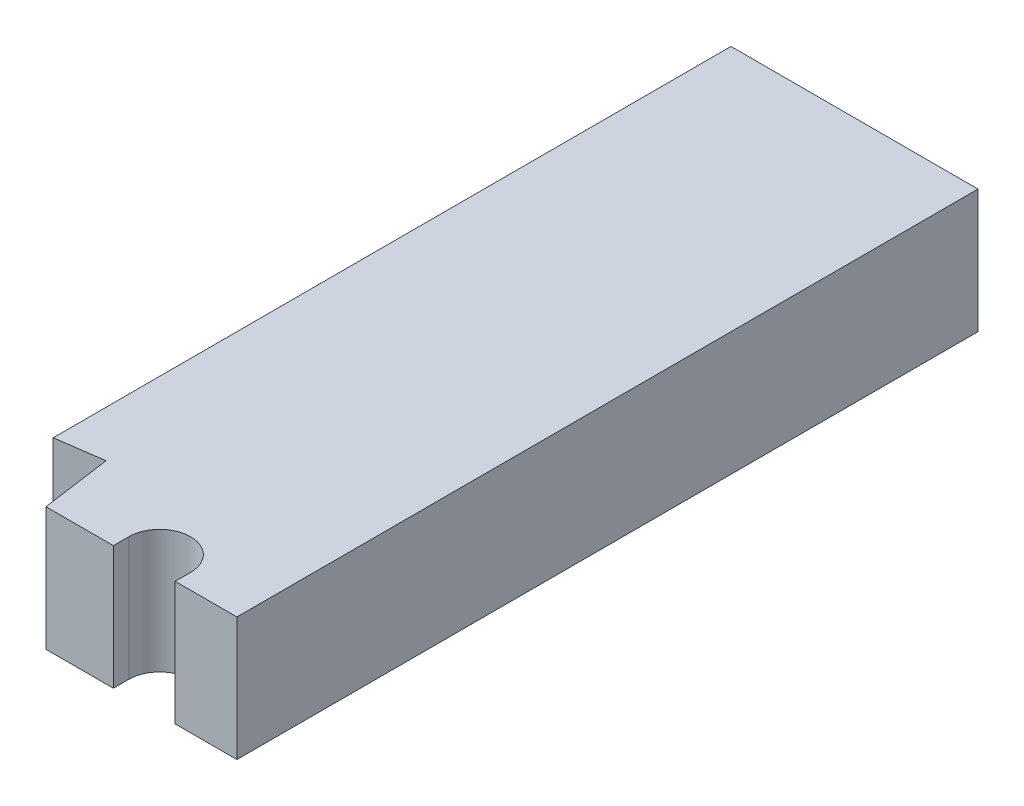
ISO-10303-21;
HEADER;
FILE_DESCRIPTION(('STEP AP214'),'2;1');
FILE_NAME('part.step','',(''),(''),'','','');
FILE_SCHEMA(('AUTOMOTIVE_DESIGN { 1 0 10303 214 1 1 1 1 }'));
ENDSEC;
DATA;
#1=APPLICATION_CONTEXT('core data for automotive mechanical design processes');
#2=APPLICATION_PROTOCOL_DEFINITION('international standard','automotive_design',2000,#1);
#3=PRODUCT_CONTEXT('',#1,'mechanical');
#4=PRODUCT('Part','Part','',(#3));
#5=PRODUCT_RELATED_PRODUCT_CATEGORY('part','',(#4));
#6=PRODUCT_DEFINITION_FORMATION('','',#4);
#7=PRODUCT_DEFINITION_CONTEXT('part definition',#1,'design');
#8=PRODUCT_DEFINITION('design','',#6,#7);
#9=PRODUCT_DEFINITION_SHAPE('','',#8);
#10=(LENGTH_UNIT() NAMED_UNIT(*) SI_UNIT(.MILLI.,.METRE.));
#11=(NAMED_UNIT(*) PLANE_ANGLE_UNIT() SI_UNIT($,.RADIAN.));
#12=(NAMED_UNIT(*) SI_UNIT($,.STERADIAN.) SOLID_ANGLE_UNIT());
#13=UNCERTAINTY_MEASURE_WITH_UNIT(LENGTH_MEASURE(1.E-05),#10,'distance_accuracy_value','');
#14=(GEOMETRIC_REPRESENTATION_CONTEXT(3) GLOBAL_UNCERTAINTY_ASSIGNED_CONTEXT((#13)) GLOBAL_UNIT_ASSIGNED_CONTEXT((#10,
#11,#12)) REPRESENTATION_CONTEXT('',''));
#15=CARTESIAN_POINT('',(0.,0.,0.));
#16=DIRECTION('',(0.,0.,1.));
#17=DIRECTION('',(1.,0.,0.));
#18=AXIS2_PLACEMENT_3D('',#15,#16,#17);
#19=CARTESIAN_POINT('',(-50.8,25.4,304.8));
#20=DIRECTION('',(0.,-1.,0.));
#21=DIRECTION('',(0.,0.,-1.));
#22=AXIS2_PLACEMENT_3D('',#19,#20,#21);
#23=PLANE('',#22);
#24=DIRECTION('',(-1.,0.,0.));
#25=VECTOR('',#24,1.);
#26=CARTESIAN_POINT('',(-50.8,25.4,304.8));
#27=LINE('',#26,#25);
#28=CARTESIAN_POINT('',(0.,25.4,304.8));
#29=VERTEX_POINT('',#28);
#30=CARTESIAN_POINT('',(-27.7126272251705,25.4,304.8));
#31=VERTEX_POINT('',#30);
#32=EDGE_CURVE('E162',#29,#31,#27,.T.);
#33=ORIENTED_EDGE('',*,*,#32,.F.);
#34=DIRECTION('',(0.,0.,-1.));
#35=VECTOR('',#34,1.);
#36=CARTESIAN_POINT('',(0.,25.4,304.8));
#37=LINE('',#36,#35);
#38=CARTESIAN_POINT('',(0.,25.4,298.45));
#39=VERTEX_POINT('',#38);
#40=EDGE_CURVE('E168',#29,#39,#37,.T.);
#41=ORIENTED_EDGE('',*,*,#40,.T.);
#42=CARTESIAN_POINT('',(12.7,25.4,298.45));
#43=DIRECTION('',(0.,1.,0.));
#44=DIRECTION('',(0.,0.,1.));
#45=AXIS2_PLACEMENT_3D('',#42,#43,#44);
#46=CIRCLE('',#45,12.7);
#47=CARTESIAN_POINT('',(25.4,25.4,298.45));
#48=VERTEX_POINT('',#47);
#49=EDGE_CURVE('E44',#48,#39,#46,.T.);
#50=ORIENTED_EDGE('',*,*,#49,.F.);
#51=DIRECTION('',(0.,0.,-1.));
#52=VECTOR('',#51,1.);
#53=CARTESIAN_POINT('',(25.4,25.4,304.8));
#54=LINE('',#53,#52);
#55=CARTESIAN_POINT('',(25.4,25.4,304.8));
#56=VERTEX_POINT('',#55);
#57=EDGE_CURVE('E68',#56,#48,#54,.T.);
#58=ORIENTED_EDGE('',*,*,#57,.F.);
#59=CARTESIAN_POINT('',(50.8,25.4,304.8));
#60=VERTEX_POINT('',#59);
#61=EDGE_CURVE('E159',#60,#56,#27,.T.);
#62=ORIENTED_EDGE('',*,*,#61,.F.);
#63=DIRECTION('',(0.,0.,-1.));
#64=VECTOR('',#63,1.);
#65=CARTESIAN_POINT('',(50.8,25.4,304.8));
#66=LINE('',#65,#64);
#67=CARTESIAN_POINT('',(50.8,25.4,0.));
#68=VERTEX_POINT('',#67);
#69=EDGE_CURVE('E11',#60,#68,#66,.T.);
#70=ORIENTED_EDGE('',*,*,#69,.T.);
#71=DIRECTION('',(-1.,0.,0.));
#72=VECTOR('',#71,1.);
#73=CARTESIAN_POINT('',(-50.8,25.4,0.));
#74=LINE('',#73,#72);
#75=CARTESIAN_POINT('',(-50.8,25.4,0.));
#76=VERTEX_POINT('',#75);
#77=EDGE_CURVE('E141',#68,#76,#74,.T.);
#78=ORIENTED_EDGE('',*,*,#77,.T.);
#79=DIRECTION('',(0.,0.,-1.));
#80=VECTOR('',#79,1.);
#81=CARTESIAN_POINT('',(-50.8,25.4,304.8));
#82=LINE('',#81,#80);
#83=CARTESIAN_POINT('',(-50.8,25.4,278.749902901081));
#84=VERTEX_POINT('',#83);
#85=EDGE_CURVE('E50',#84,#76,#82,.T.);
#86=ORIENTED_EDGE('',*,*,#85,.F.);
#87=DIRECTION('',(-0.99026806874157,0.,0.139173100960067));
#88=VECTOR('',#87,1.);
#89=CARTESIAN_POINT('',(-54.3901899415612,25.4,279.254471192208));
#90=LINE('',#89,#88);
#91=CARTESIAN_POINT('',(-31.75,25.4,276.0726));
#92=VERTEX_POINT('',#91);
#93=EDGE_CURVE('E145',#92,#84,#90,.T.);
#94=ORIENTED_EDGE('',*,*,#93,.F.);
#95=DIRECTION('',(-0.139173100960066,0.,-0.99026806874157));
#96=VECTOR('',#95,1.);
#97=CARTESIAN_POINT('',(-28.1598100584389,25.4,301.618128807792));
#98=LINE('',#97,#96);
#99=EDGE_CURVE('E172',#31,#92,#98,.T.);
#100=ORIENTED_EDGE('',*,*,#99,.F.);
#101=EDGE_LOOP('',(#33,#41,#50,#58,#62,#70,#78,#86,#94,#100));
#102=FACE_BOUND('',#101,.T.);
#103=ADVANCED_FACE('F40',(#102),#23,.F.);
#104=CARTESIAN_POINT('',(-50.8,25.4,304.8));
#105=DIRECTION('',(1.,0.,0.));
#106=DIRECTION('',(0.,1.,0.));
#107=AXIS2_PLACEMENT_3D('',#104,#105,#106);
#108=PLANE('',#107);
#109=DIRECTION('',(0.,1.,0.));
#110=VECTOR('',#109,1.);
#111=CARTESIAN_POINT('',(-50.8,-25.4,278.749902901081));
#112=LINE('',#111,#110);
#113=CARTESIAN_POINT('',(-50.8,-25.4,278.749902901081));
#114=VERTEX_POINT('',#113);
#115=EDGE_CURVE('E79',#114,#84,#112,.T.);
#116=ORIENTED_EDGE('',*,*,#115,.T.);
#117=ORIENTED_EDGE('',*,*,#85,.T.);
#118=DIRECTION('',(0.,-1.,0.));
#119=VECTOR('',#118,1.);
#120=CARTESIAN_POINT('',(-50.8,25.4,0.));
#121=LINE('',#120,#119);
#122=CARTESIAN_POINT('',(-50.8,-25.4,0.));
#123=VERTEX_POINT('',#122);
#124=EDGE_CURVE('E130',#76,#123,#121,.T.);
#125=ORIENTED_EDGE('',*,*,#124,.T.);
#126=DIRECTION('',(0.,0.,-1.));
#127=VECTOR('',#126,1.);
#128=CARTESIAN_POINT('',(-50.8,-25.4,304.8));
#129=LINE('',#128,#127);
#130=EDGE_CURVE('E124',#114,#123,#129,.T.);
#131=ORIENTED_EDGE('',*,*,#130,.F.);
#132=EDGE_LOOP('',(#116,#117,#125,#131));
#133=FACE_BOUND('',#132,.T.);
#134=ADVANCED_FACE('F154',(#133),#108,.F.);
#135=CARTESIAN_POINT('',(-50.8,-25.4,304.8));
#136=DIRECTION('',(0.,1.,0.));
#137=DIRECTION('',(0.,0.,1.));
#138=AXIS2_PLACEMENT_3D('',#135,#136,#137);
#139=PLANE('',#138);
#140=CARTESIAN_POINT('',(12.7,-25.4,298.45));
#141=DIRECTION('',(0.,1.,0.));
#142=DIRECTION('',(0.,0.,1.));
#143=AXIS2_PLACEMENT_3D('',#140,#141,#142);
#144=CIRCLE('',#143,12.7);
#145=CARTESIAN_POINT('',(25.4,-25.4,298.45));
#146=VERTEX_POINT('',#145);
#147=CARTESIAN_POINT('',(0.,-25.4,298.45));
#148=VERTEX_POINT('',#147);
#149=EDGE_CURVE('E196',#146,#148,#144,.T.);
#150=ORIENTED_EDGE('',*,*,#149,.T.);
#151=DIRECTION('',(0.,0.,1.));
#152=VECTOR('',#151,1.);
#153=CARTESIAN_POINT('',(0.,-25.4,0.));
#154=LINE('',#153,#152);
#155=CARTESIAN_POINT('',(0.,-25.4,304.8));
#156=VERTEX_POINT('',#155);
#157=EDGE_CURVE('E191',#148,#156,#154,.T.);
#158=ORIENTED_EDGE('',*,*,#157,.T.);
#159=DIRECTION('',(1.,0.,0.));
#160=VECTOR('',#159,1.);
#161=CARTESIAN_POINT('',(-50.8,-25.4,304.8));
#162=LINE('',#161,#160);
#163=CARTESIAN_POINT('',(-27.7126272251705,-25.4,304.8));
#164=VERTEX_POINT('',#163);
#165=EDGE_CURVE('E137',#164,#156,#162,.T.);
#166=ORIENTED_EDGE('',*,*,#165,.F.);
#167=DIRECTION('',(0.139173100960066,0.,0.99026806874157));
#168=VECTOR('',#167,1.);
#169=CARTESIAN_POINT('',(-69.182990161783,-25.4,9.72303518454435));
#170=LINE('',#169,#168);
#171=CARTESIAN_POINT('',(-31.75,-25.4,276.0726));
#172=VERTEX_POINT('',#171);
#173=EDGE_CURVE('E183',#172,#164,#170,.T.);
#174=ORIENTED_EDGE('',*,*,#173,.F.);
#175=DIRECTION('',(0.99026806874157,0.,-0.139173100960067));
#176=VECTOR('',#175,1.);
#177=CARTESIAN_POINT('',(37.4329901617833,-25.4,266.349564815455));
#178=LINE('',#177,#176);
#179=EDGE_CURVE('E178',#114,#172,#178,.T.);
#180=ORIENTED_EDGE('',*,*,#179,.F.);
#181=ORIENTED_EDGE('',*,*,#130,.T.);
#182=DIRECTION('',(1.,0.,0.));
#183=VECTOR('',#182,1.);
#184=CARTESIAN_POINT('',(-50.8,-25.4,0.));
#185=LINE('',#184,#183);
#186=CARTESIAN_POINT('',(50.8,-25.4,0.));
#187=VERTEX_POINT('',#186);
#188=EDGE_CURVE('E116',#123,#187,#185,.T.);
#189=ORIENTED_EDGE('',*,*,#188,.T.);
#190=DIRECTION('',(0.,0.,-1.));
#191=VECTOR('',#190,1.);
#192=CARTESIAN_POINT('',(50.8,-25.4,304.8));
#193=LINE('',#192,#191);
#194=CARTESIAN_POINT('',(50.8,-25.4,304.8));
#195=VERTEX_POINT('',#194);
#196=EDGE_CURVE('E121',#195,#187,#193,.T.);
#197=ORIENTED_EDGE('',*,*,#196,.F.);
#198=CARTESIAN_POINT('',(25.4,-25.4,304.8));
#199=VERTEX_POINT('',#198);
#200=EDGE_CURVE('E147',#199,#195,#162,.T.);
#201=ORIENTED_EDGE('',*,*,#200,.F.);
#202=DIRECTION('',(0.,0.,1.));
#203=VECTOR('',#202,1.);
#204=CARTESIAN_POINT('',(25.4,-25.4,0.));
#205=LINE('',#204,#203);
#206=EDGE_CURVE('E58',#146,#199,#205,.T.);
#207=ORIENTED_EDGE('',*,*,#206,.F.);
#208=EDGE_LOOP('',(#150,#158,#166,#174,#180,#181,#189,#197,#201,#207));
#209=FACE_BOUND('',#208,.T.);
#210=ADVANCED_FACE('F119',(#209),#139,.F.);
#211=CARTESIAN_POINT('',(0.,0.,304.8));
#212=DIRECTION('',(0.,0.,1.));
#213=DIRECTION('',(1.,0.,0.));
#214=AXIS2_PLACEMENT_3D('',#211,#212,#213);
#215=PLANE('',#214);
#216=ORIENTED_EDGE('',*,*,#61,.T.);
#217=DIRECTION('',(0.,1.,0.));
#218=VECTOR('',#217,1.);
#219=CARTESIAN_POINT('',(25.4,-25.4,304.8));
#220=LINE('',#219,#218);
#221=EDGE_CURVE('E189',#199,#56,#220,.T.);
#222=ORIENTED_EDGE('',*,*,#221,.F.);
#223=ORIENTED_EDGE('',*,*,#200,.T.);
#224=DIRECTION('',(0.,1.,0.));
#225=VECTOR('',#224,1.);
#226=CARTESIAN_POINT('',(50.8,25.4,304.8));
#227=LINE('',#226,#225);
#228=EDGE_CURVE('E129',#195,#60,#227,.T.);
#229=ORIENTED_EDGE('',*,*,#228,.T.);
#230=EDGE_LOOP('',(#216,#222,#223,#229));
#231=FACE_BOUND('',#230,.T.);
#232=ADVANCED_FACE('F163',(#231),#215,.T.);
#233=DIRECTION('',(0.,1.,0.));
#234=VECTOR('',#233,1.);
#235=CARTESIAN_POINT('',(0.,-25.4,304.8));
#236=LINE('',#235,#234);
#237=EDGE_CURVE('E174',#156,#29,#236,.T.);
#238=ORIENTED_EDGE('',*,*,#237,.T.);
#239=ORIENTED_EDGE('',*,*,#32,.T.);
#240=DIRECTION('',(0.,1.,0.));
#241=VECTOR('',#240,1.);
#242=CARTESIAN_POINT('',(-27.7126272251705,-25.4,304.8));
#243=LINE('',#242,#241);
#244=EDGE_CURVE('E180',#164,#31,#243,.T.);
#245=ORIENTED_EDGE('',*,*,#244,.F.);
#246=ORIENTED_EDGE('',*,*,#165,.T.);
#247=EDGE_LOOP('',(#238,#239,#245,#246));
#248=FACE_BOUND('',#247,.T.);
#249=ADVANCED_FACE('F212',(#248),#215,.T.);
#250=CARTESIAN_POINT('',(50.8,25.4,304.8));
#251=DIRECTION('',(-1.,0.,0.));
#252=DIRECTION('',(0.,-1.,0.));
#253=AXIS2_PLACEMENT_3D('',#250,#251,#252);
#254=PLANE('',#253);
#255=DIRECTION('',(0.,1.,0.));
#256=VECTOR('',#255,1.);
#257=CARTESIAN_POINT('',(50.8,25.4,0.));
#258=LINE('',#257,#256);
#259=EDGE_CURVE('E135',#187,#68,#258,.T.);
#260=ORIENTED_EDGE('',*,*,#259,.T.);
#261=ORIENTED_EDGE('',*,*,#69,.F.);
#262=ORIENTED_EDGE('',*,*,#228,.F.);
#263=ORIENTED_EDGE('',*,*,#196,.T.);
#264=EDGE_LOOP('',(#260,#261,#262,#263));
#265=FACE_BOUND('',#264,.T.);
#266=ADVANCED_FACE('F42',(#265),#254,.F.);
#267=CARTESIAN_POINT('',(0.,0.,0.));
#268=DIRECTION('',(0.,0.,1.));
#269=DIRECTION('',(1.,0.,0.));
#270=AXIS2_PLACEMENT_3D('',#267,#268,#269);
#271=PLANE('',#270);
#272=ORIENTED_EDGE('',*,*,#259,.F.);
#273=ORIENTED_EDGE('',*,*,#188,.F.);
#274=ORIENTED_EDGE('',*,*,#124,.F.);
#275=ORIENTED_EDGE('',*,*,#77,.F.);
#276=EDGE_LOOP('',(#272,#273,#274,#275));
#277=FACE_BOUND('',#276,.T.);
#278=ADVANCED_FACE('F139',(#277),#271,.F.);
#279=CARTESIAN_POINT('',(37.4329901617833,-25.4,266.349564815455));
#280=DIRECTION('',(0.139173100960067,0.,0.99026806874157));
#281=DIRECTION('',(0.99026806874157,0.,-0.139173100960067));
#282=AXIS2_PLACEMENT_3D('',#279,#280,#281);
#283=PLANE('',#282);
#284=ORIENTED_EDGE('',*,*,#93,.T.);
#285=ORIENTED_EDGE('',*,*,#115,.F.);
#286=ORIENTED_EDGE('',*,*,#179,.T.);
#287=DIRECTION('',(0.,1.,0.));
#288=VECTOR('',#287,1.);
#289=CARTESIAN_POINT('',(-31.75,-25.4,276.0726));
#290=LINE('',#289,#288);
#291=EDGE_CURVE('E175',#172,#92,#290,.T.);
#292=ORIENTED_EDGE('',*,*,#291,.T.);
#293=EDGE_LOOP('',(#284,#285,#286,#292));
#294=FACE_BOUND('',#293,.T.);
#295=ADVANCED_FACE('F219',(#294),#283,.T.);
#296=CARTESIAN_POINT('',(-69.182990161783,-25.4,9.72303518454435));
#297=DIRECTION('',(-0.99026806874157,0.,0.139173100960066));
#298=DIRECTION('',(0.139173100960066,0.,0.99026806874157));
#299=AXIS2_PLACEMENT_3D('',#296,#297,#298);
#300=PLANE('',#299);
#301=ORIENTED_EDGE('',*,*,#99,.T.);
#302=ORIENTED_EDGE('',*,*,#291,.F.);
#303=ORIENTED_EDGE('',*,*,#173,.T.);
#304=ORIENTED_EDGE('',*,*,#244,.T.);
#305=EDGE_LOOP('',(#301,#302,#303,#304));
#306=FACE_BOUND('',#305,.T.);
#307=ADVANCED_FACE('F217',(#306),#300,.T.);
#308=CARTESIAN_POINT('',(12.7,-25.4,298.45));
#309=DIRECTION('',(0.,1.,0.));
#310=DIRECTION('',(0.,0.,1.));
#311=AXIS2_PLACEMENT_3D('',#308,#309,#310);
#312=CYLINDRICAL_SURFACE('',#311,12.7);
#313=DIRECTION('',(0.,1.,0.));
#314=VECTOR('',#313,1.);
#315=CARTESIAN_POINT('',(0.,-25.4,298.45));
#316=LINE('',#315,#314);
#317=EDGE_CURVE('E185',#148,#39,#316,.T.);
#318=ORIENTED_EDGE('',*,*,#317,.F.);
#319=ORIENTED_EDGE('',*,*,#149,.F.);
#320=DIRECTION('',(0.,1.,0.));
#321=VECTOR('',#320,1.);
#322=CARTESIAN_POINT('',(25.4,-25.4,298.45));
#323=LINE('',#322,#321);
#324=EDGE_CURVE('E187',#146,#48,#323,.T.);
#325=ORIENTED_EDGE('',*,*,#324,.T.);
#326=ORIENTED_EDGE('',*,*,#49,.T.);
#327=EDGE_LOOP('',(#318,#319,#325,#326));
#328=FACE_BOUND('',#327,.T.);
#329=ADVANCED_FACE('F206',(#328),#312,.F.);
#330=CARTESIAN_POINT('',(0.,-25.4,0.));
#331=DIRECTION('',(-1.,0.,0.));
#332=DIRECTION('',(0.,0.,1.));
#333=AXIS2_PLACEMENT_3D('',#330,#331,#332);
#334=PLANE('',#333);
#335=ORIENTED_EDGE('',*,*,#237,.F.);
#336=ORIENTED_EDGE('',*,*,#157,.F.);
#337=ORIENTED_EDGE('',*,*,#317,.T.);
#338=ORIENTED_EDGE('',*,*,#40,.F.);
#339=EDGE_LOOP('',(#335,#336,#337,#338));
#340=FACE_BOUND('',#339,.T.);
#341=ADVANCED_FACE('F210',(#340),#334,.F.);
#342=CARTESIAN_POINT('',(25.4,-25.4,0.));
#343=DIRECTION('',(-1.,0.,0.));
#344=DIRECTION('',(0.,0.,1.));
#345=AXIS2_PLACEMENT_3D('',#342,#343,#344);
#346=PLANE('',#345);
#347=ORIENTED_EDGE('',*,*,#57,.T.);
#348=ORIENTED_EDGE('',*,*,#324,.F.);
#349=ORIENTED_EDGE('',*,*,#206,.T.);
#350=ORIENTED_EDGE('',*,*,#221,.T.);
#351=EDGE_LOOP('',(#347,#348,#349,#350));
#352=FACE_BOUND('',#351,.T.);
#353=ADVANCED_FACE('F301',(#352),#346,.T.);
#354=CLOSED_SHELL('',(#103,#134,#210,#232,#249,#266,#278,#295,#307,#329,#341,#353));
#355=MANIFOLD_SOLID_BREP('B2',#354);
#356=ADVANCED_BREP_SHAPE_REPRESENTATION('',(#18,#355),#14);
#357=SHAPE_DEFINITION_REPRESENTATION(#9,#356);
ENDSEC;
END-ISO-10303-21;
